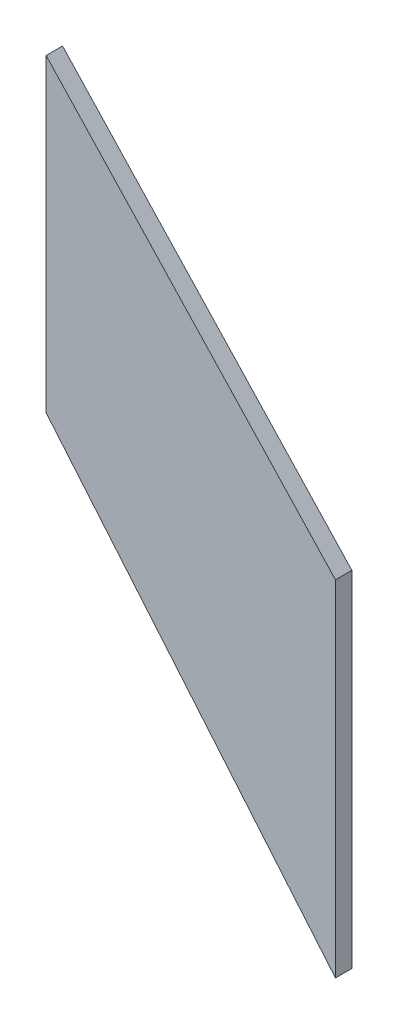
ISO-10303-21;
HEADER;
FILE_DESCRIPTION(('STEP AP214'),'2;1');
FILE_NAME('part.step','',(''),(''),'','','');
FILE_SCHEMA(('AUTOMOTIVE_DESIGN { 1 0 10303 214 1 1 1 1 }'));
ENDSEC;
DATA;
#1=APPLICATION_CONTEXT('core data for automotive mechanical design processes');
#2=APPLICATION_PROTOCOL_DEFINITION('international standard','automotive_design',2000,#1);
#3=PRODUCT_CONTEXT('',#1,'mechanical');
#4=PRODUCT('Part','Part','',(#3));
#5=PRODUCT_RELATED_PRODUCT_CATEGORY('part','',(#4));
#6=PRODUCT_DEFINITION_FORMATION('','',#4);
#7=PRODUCT_DEFINITION_CONTEXT('part definition',#1,'design');
#8=PRODUCT_DEFINITION('design','',#6,#7);
#9=PRODUCT_DEFINITION_SHAPE('','',#8);
#10=(LENGTH_UNIT() NAMED_UNIT(*) SI_UNIT(.MILLI.,.METRE.));
#11=(NAMED_UNIT(*) PLANE_ANGLE_UNIT() SI_UNIT($,.RADIAN.));
#12=(NAMED_UNIT(*) SI_UNIT($,.STERADIAN.) SOLID_ANGLE_UNIT());
#13=UNCERTAINTY_MEASURE_WITH_UNIT(LENGTH_MEASURE(1.E-05),#10,'distance_accuracy_value','');
#14=(GEOMETRIC_REPRESENTATION_CONTEXT(3) GLOBAL_UNCERTAINTY_ASSIGNED_CONTEXT((#13)) GLOBAL_UNIT_ASSIGNED_CONTEXT((#10,
#11,#12)) REPRESENTATION_CONTEXT('',''));
#15=CARTESIAN_POINT('',(0.,0.,0.));
#16=DIRECTION('',(0.,0.,1.));
#17=DIRECTION('',(1.,0.,0.));
#18=AXIS2_PLACEMENT_3D('',#15,#16,#17);
#19=CARTESIAN_POINT('',(-101.23737050154,0.,5.08));
#20=DIRECTION('',(-1.,0.,0.));
#21=DIRECTION('',(0.,-1.,0.));
#22=AXIS2_PLACEMENT_3D('',#19,#20,#21);
#23=PLANE('',#22);
#24=DIRECTION('',(0.,1.,0.));
#25=VECTOR('',#24,1.);
#26=CARTESIAN_POINT('',(-101.23737050154,0.,0.));
#27=LINE('',#26,#25);
#28=CARTESIAN_POINT('',(-101.23737050154,120.65,0.));
#29=VERTEX_POINT('',#28);
#30=CARTESIAN_POINT('',(-101.23737050154,216.543480298302,0.));
#31=VERTEX_POINT('',#30);
#32=EDGE_CURVE('E106',#29,#31,#27,.T.);
#33=ORIENTED_EDGE('',*,*,#32,.F.);
#34=DIRECTION('',(0.,0.,-1.));
#35=VECTOR('',#34,1.);
#36=CARTESIAN_POINT('',(-101.23737050154,120.65,5.08));
#37=LINE('',#36,#35);
#38=CARTESIAN_POINT('',(-101.23737050154,120.65,5.08));
#39=VERTEX_POINT('',#38);
#40=EDGE_CURVE('E70',#39,#29,#37,.T.);
#41=ORIENTED_EDGE('',*,*,#40,.F.);
#42=DIRECTION('',(0.,1.,0.));
#43=VECTOR('',#42,1.);
#44=CARTESIAN_POINT('',(-101.23737050154,0.,5.08));
#45=LINE('',#44,#43);
#46=CARTESIAN_POINT('',(-101.23737050154,216.543480298302,5.08));
#47=VERTEX_POINT('',#46);
#48=EDGE_CURVE('E117',#39,#47,#45,.T.);
#49=ORIENTED_EDGE('',*,*,#48,.T.);
#50=DIRECTION('',(0.,0.,-1.));
#51=VECTOR('',#50,1.);
#52=CARTESIAN_POINT('',(-101.23737050154,216.543480298302,5.08));
#53=LINE('',#52,#51);
#54=EDGE_CURVE('E104',#47,#31,#53,.T.);
#55=ORIENTED_EDGE('',*,*,#54,.T.);
#56=EDGE_LOOP('',(#33,#41,#49,#55));
#57=FACE_BOUND('',#56,.T.);
#58=ADVANCED_FACE('F47',(#57),#23,.T.);
#59=CARTESIAN_POINT('',(0.,0.,5.08));
#60=DIRECTION('',(0.766044443118974,0.642787609686543,0.));
#61=DIRECTION('',(-0.642787609686544,0.766044443118975,0.));
#62=AXIS2_PLACEMENT_3D('',#59,#60,#61);
#63=PLANE('',#62);
#64=CARTESIAN_POINT('',(-16.9779069309074,20.2334815796387,2.54));
#65=DIRECTION('',(-0.766044443118974,-0.642787609686544,0.));
#66=DIRECTION('',(0.642787609686544,-0.766044443118974,0.));
#67=AXIS2_PLACEMENT_3D('',#64,#65,#66);
#68=CIRCLE('',#67,1.4224);
#69=CARTESIAN_POINT('',(-16.0636058348892,19.1438599637463,2.54));
#70=VERTEX_POINT('',#69);
#71=EDGE_CURVE('E171',#70,#70,#68,.T.);
#72=ORIENTED_EDGE('',*,*,#71,.F.);
#73=EDGE_LOOP('',(#72));
#74=FACE_BOUND('',#73,.T.);
#75=CARTESIAN_POINT('',(-98.6119333610984,117.521125855748,2.54));
#76=DIRECTION('',(-0.766044443118974,-0.642787609686544,0.));
#77=DIRECTION('',(0.642787609686544,-0.766044443118974,0.));
#78=AXIS2_PLACEMENT_3D('',#75,#76,#77);
#79=CIRCLE('',#78,1.4224);
#80=CARTESIAN_POINT('',(-97.6976322650803,116.431504239856,2.54));
#81=VERTEX_POINT('',#80);
#82=EDGE_CURVE('E175',#81,#81,#79,.T.);
#83=ORIENTED_EDGE('',*,*,#82,.F.);
#84=EDGE_LOOP('',(#83));
#85=FACE_BOUND('',#84,.T.);
#86=DIRECTION('',(0.642787609686544,-0.766044443118974,0.));
#87=VECTOR('',#86,1.);
#88=CARTESIAN_POINT('',(0.,0.,0.));
#89=LINE('',#88,#87);
#90=CARTESIAN_POINT('',(-11.5787726240561,13.7990438725502,0.));
#91=VERTEX_POINT('',#90);
#92=EDGE_CURVE('E112',#29,#91,#89,.T.);
#93=ORIENTED_EDGE('',*,*,#92,.T.);
#94=DIRECTION('',(0.,0.,1.));
#95=VECTOR('',#94,1.);
#96=CARTESIAN_POINT('',(-11.5787726240561,13.7990438725502,5.08));
#97=LINE('',#96,#95);
#98=CARTESIAN_POINT('',(-11.5787726240561,13.7990438725502,5.08));
#99=VERTEX_POINT('',#98);
#100=EDGE_CURVE('E107',#91,#99,#97,.T.);
#101=ORIENTED_EDGE('',*,*,#100,.T.);
#102=DIRECTION('',(0.642787609686544,-0.766044443118974,0.));
#103=VECTOR('',#102,1.);
#104=CARTESIAN_POINT('',(0.,0.,5.08));
#105=LINE('',#104,#103);
#106=EDGE_CURVE('E98',#39,#99,#105,.T.);
#107=ORIENTED_EDGE('',*,*,#106,.F.);
#108=ORIENTED_EDGE('',*,*,#40,.T.);
#109=EDGE_LOOP('',(#93,#101,#107,#108));
#110=FACE_BOUND('',#109,.T.);
#111=ADVANCED_FACE('F133',(#74,#85,#110),#63,.F.);
#112=CARTESIAN_POINT('',(0.,0.,5.08));
#113=DIRECTION('',(0.,0.,1.));
#114=DIRECTION('',(1.,0.,0.));
#115=AXIS2_PLACEMENT_3D('',#112,#113,#114);
#116=PLANE('',#115);
#117=DIRECTION('',(0.,-1.,0.));
#118=VECTOR('',#117,1.);
#119=CARTESIAN_POINT('',(-11.5787726240561,133.188204813311,5.08));
#120=LINE('',#119,#118);
#121=CARTESIAN_POINT('',(-11.5787726240561,120.655051317617,5.08));
#122=VERTEX_POINT('',#121);
#123=EDGE_CURVE('E87',#122,#99,#120,.T.);
#124=ORIENTED_EDGE('',*,*,#123,.F.);
#125=DIRECTION('',(0.682980471281743,-0.730436633697796,0.));
#126=VECTOR('',#125,1.);
#127=CARTESIAN_POINT('',(-101.23737050154,216.543480298302,5.08));
#128=LINE('',#127,#126);
#129=EDGE_CURVE('E97',#47,#122,#128,.T.);
#130=ORIENTED_EDGE('',*,*,#129,.F.);
#131=ORIENTED_EDGE('',*,*,#48,.F.);
#132=ORIENTED_EDGE('',*,*,#106,.T.);
#133=EDGE_LOOP('',(#124,#130,#131,#132));
#134=FACE_BOUND('',#133,.T.);
#135=ADVANCED_FACE('F95',(#134),#116,.T.);
#136=CARTESIAN_POINT('',(0.,0.,0.));
#137=DIRECTION('',(0.,0.,1.));
#138=DIRECTION('',(1.,0.,0.));
#139=AXIS2_PLACEMENT_3D('',#136,#137,#138);
#140=PLANE('',#139);
#141=DIRECTION('',(0.682980471281743,-0.730436633697796,0.));
#142=VECTOR('',#141,1.);
#143=CARTESIAN_POINT('',(54.0139513663311,50.5046875499794,0.));
#144=LINE('',#143,#142);
#145=CARTESIAN_POINT('',(-11.5787726240561,120.655051317617,0.));
#146=VERTEX_POINT('',#145);
#147=EDGE_CURVE('E55',#31,#146,#144,.T.);
#148=ORIENTED_EDGE('',*,*,#147,.T.);
#149=DIRECTION('',(0.,-1.,0.));
#150=VECTOR('',#149,1.);
#151=CARTESIAN_POINT('',(-11.5787726240561,0.,0.));
#152=LINE('',#151,#150);
#153=EDGE_CURVE('E62',#146,#91,#152,.T.);
#154=ORIENTED_EDGE('',*,*,#153,.T.);
#155=ORIENTED_EDGE('',*,*,#92,.F.);
#156=ORIENTED_EDGE('',*,*,#32,.T.);
#157=EDGE_LOOP('',(#148,#154,#155,#156));
#158=FACE_BOUND('',#157,.T.);
#159=ADVANCED_FACE('F130',(#158),#140,.F.);
#160=CARTESIAN_POINT('',(-101.23737050154,216.543480298302,-45.72));
#161=DIRECTION('',(-0.730436633697796,-0.682980471281743,0.));
#162=DIRECTION('',(0.682980471281743,-0.730436633697796,0.));
#163=AXIS2_PLACEMENT_3D('',#160,#161,#162);
#164=PLANE('',#163);
#165=ORIENTED_EDGE('',*,*,#129,.T.);
#166=DIRECTION('',(0.,0.,-1.));
#167=VECTOR('',#166,1.);
#168=CARTESIAN_POINT('',(-11.5787726240561,120.655051317617,-45.72));
#169=LINE('',#168,#167);
#170=EDGE_CURVE('E11',#122,#146,#169,.T.);
#171=ORIENTED_EDGE('',*,*,#170,.T.);
#172=ORIENTED_EDGE('',*,*,#147,.F.);
#173=ORIENTED_EDGE('',*,*,#54,.F.);
#174=EDGE_LOOP('',(#165,#171,#172,#173));
#175=FACE_BOUND('',#174,.T.);
#176=ADVANCED_FACE('F102',(#175),#164,.F.);
#177=CARTESIAN_POINT('',(-11.5787726240561,133.188204813311,-20.32));
#178=DIRECTION('',(-1.,0.,0.));
#179=DIRECTION('',(0.,0.,1.));
#180=AXIS2_PLACEMENT_3D('',#177,#178,#179);
#181=PLANE('',#180);
#182=ORIENTED_EDGE('',*,*,#153,.F.);
#183=ORIENTED_EDGE('',*,*,#170,.F.);
#184=ORIENTED_EDGE('',*,*,#123,.T.);
#185=ORIENTED_EDGE('',*,*,#100,.F.);
#186=EDGE_LOOP('',(#182,#183,#184,#185));
#187=FACE_BOUND('',#186,.T.);
#188=ADVANCED_FACE('F86',(#187),#181,.F.);
#189=CARTESIAN_POINT('',(-94.720427590054,120.786486912956,2.54));
#190=DIRECTION('',(-0.766044443118974,-0.642787609686544,0.));
#191=DIRECTION('',(0.642787609686544,-0.766044443118974,0.));
#192=AXIS2_PLACEMENT_3D('',#189,#190,#191);
#193=CYLINDRICAL_SURFACE('',#192,1.4224);
#194=CARTESIAN_POINT('',(-94.720427590054,120.786486912956,2.54));
#195=DIRECTION('',(-0.766044443118974,-0.642787609686544,0.));
#196=DIRECTION('',(0.642787609686544,-0.766044443118974,0.));
#197=AXIS2_PLACEMENT_3D('',#194,#195,#196);
#198=CIRCLE('',#197,1.4224);
#199=CARTESIAN_POINT('',(-93.8061264940359,119.696865297064,2.54));
#200=VERTEX_POINT('',#199);
#201=EDGE_CURVE('E181',#200,#200,#198,.T.);
#202=ORIENTED_EDGE('',*,*,#201,.F.);
#203=EDGE_LOOP('',(#202));
#204=FACE_BOUND('',#203,.T.);
#205=ORIENTED_EDGE('',*,*,#82,.T.);
#206=EDGE_LOOP('',(#205));
#207=FACE_BOUND('',#206,.T.);
#208=ADVANCED_FACE('F152',(#204,#207),#193,.F.);
#209=CARTESIAN_POINT('',(-94.720427590054,120.786486912956,2.54));
#210=DIRECTION('',(-0.766044443118974,-0.642787609686544,0.));
#211=DIRECTION('',(0.642787609686544,-0.766044443118974,0.));
#212=AXIS2_PLACEMENT_3D('',#209,#210,#211);
#213=PLANE('',#212);
#214=ORIENTED_EDGE('',*,*,#201,.T.);
#215=EDGE_LOOP('',(#214));
#216=FACE_BOUND('',#215,.T.);
#217=ADVANCED_FACE('F153',(#216),#213,.T.);
#218=CARTESIAN_POINT('',(-13.086401159863,23.4988426368464,2.54));
#219=DIRECTION('',(-0.766044443118974,-0.642787609686544,0.));
#220=DIRECTION('',(0.642787609686544,-0.766044443118974,0.));
#221=AXIS2_PLACEMENT_3D('',#218,#219,#220);
#222=CYLINDRICAL_SURFACE('',#221,1.4224);
#223=CARTESIAN_POINT('',(-13.086401159863,23.4988426368464,2.54));
#224=DIRECTION('',(-0.766044443118974,-0.642787609686544,0.));
#225=DIRECTION('',(0.642787609686544,-0.766044443118974,0.));
#226=AXIS2_PLACEMENT_3D('',#223,#224,#225);
#227=CIRCLE('',#226,1.4224);
#228=CARTESIAN_POINT('',(-12.1721000638448,22.409221020954,2.54));
#229=VERTEX_POINT('',#228);
#230=EDGE_CURVE('E100',#229,#229,#227,.T.);
#231=ORIENTED_EDGE('',*,*,#230,.F.);
#232=EDGE_LOOP('',(#231));
#233=FACE_BOUND('',#232,.T.);
#234=ORIENTED_EDGE('',*,*,#71,.T.);
#235=EDGE_LOOP('',(#234));
#236=FACE_BOUND('',#235,.T.);
#237=ADVANCED_FACE('F156',(#233,#236),#222,.F.);
#238=CARTESIAN_POINT('',(-13.086401159863,23.4988426368464,2.54));
#239=DIRECTION('',(-0.766044443118974,-0.642787609686544,0.));
#240=DIRECTION('',(0.642787609686544,-0.766044443118974,0.));
#241=AXIS2_PLACEMENT_3D('',#238,#239,#240);
#242=PLANE('',#241);
#243=ORIENTED_EDGE('',*,*,#230,.T.);
#244=EDGE_LOOP('',(#243));
#245=FACE_BOUND('',#244,.T.);
#246=ADVANCED_FACE('F162',(#245),#242,.T.);
#247=CLOSED_SHELL('',(#58,#111,#135,#159,#176,#188,#208,#217,#237,#246));
#248=MANIFOLD_SOLID_BREP('B2',#247);
#249=ADVANCED_BREP_SHAPE_REPRESENTATION('',(#18,#248),#14);
#250=SHAPE_DEFINITION_REPRESENTATION(#9,#249);
ENDSEC;
END-ISO-10303-21;
